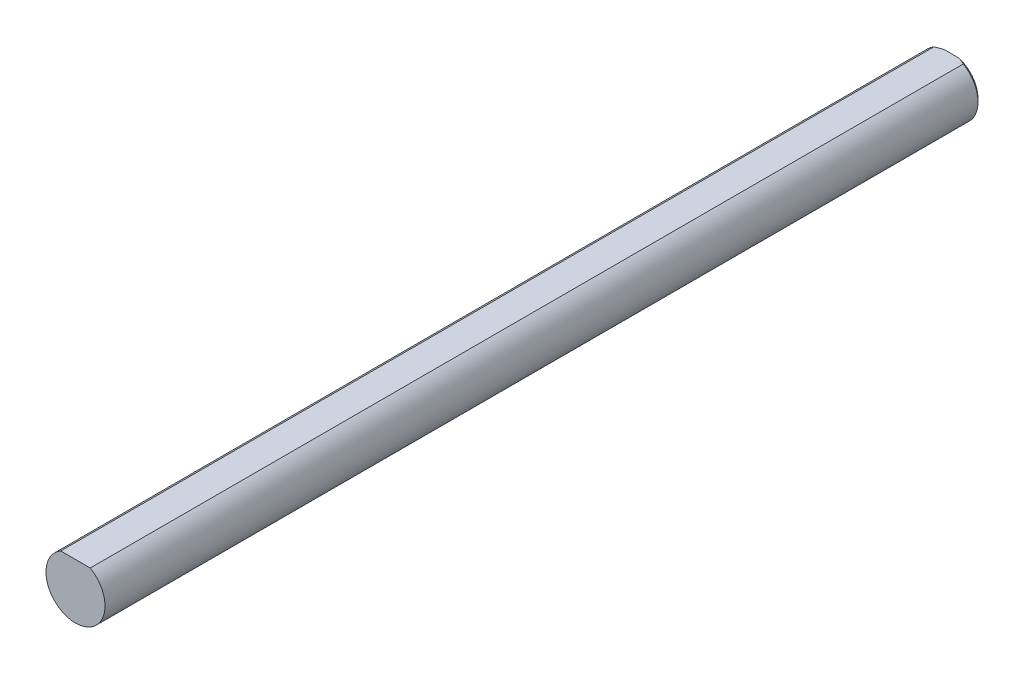
ISO-10303-21;
HEADER;
FILE_DESCRIPTION(('STEP AP214'),'2;1');
FILE_NAME('part.step','',(''),(''),'','','');
FILE_SCHEMA(('AUTOMOTIVE_DESIGN { 1 0 10303 214 1 1 1 1 }'));
ENDSEC;
DATA;
#1=APPLICATION_CONTEXT('core data for automotive mechanical design processes');
#2=APPLICATION_PROTOCOL_DEFINITION('international standard','automotive_design',2000,#1);
#3=PRODUCT_CONTEXT('',#1,'mechanical');
#4=PRODUCT('Part','Part','',(#3));
#5=PRODUCT_RELATED_PRODUCT_CATEGORY('part','',(#4));
#6=PRODUCT_DEFINITION_FORMATION('','',#4);
#7=PRODUCT_DEFINITION_CONTEXT('part definition',#1,'design');
#8=PRODUCT_DEFINITION('design','',#6,#7);
#9=PRODUCT_DEFINITION_SHAPE('','',#8);
#10=(LENGTH_UNIT() NAMED_UNIT(*) SI_UNIT(.MILLI.,.METRE.));
#11=(NAMED_UNIT(*) PLANE_ANGLE_UNIT() SI_UNIT($,.RADIAN.));
#12=(NAMED_UNIT(*) SI_UNIT($,.STERADIAN.) SOLID_ANGLE_UNIT());
#13=UNCERTAINTY_MEASURE_WITH_UNIT(LENGTH_MEASURE(1.E-05),#10,'distance_accuracy_value','');
#14=(GEOMETRIC_REPRESENTATION_CONTEXT(3) GLOBAL_UNCERTAINTY_ASSIGNED_CONTEXT((#13)) GLOBAL_UNIT_ASSIGNED_CONTEXT((#10,
#11,#12)) REPRESENTATION_CONTEXT('',''));
#15=CARTESIAN_POINT('',(0.,0.,0.));
#16=DIRECTION('',(0.,0.,1.));
#17=DIRECTION('',(1.,0.,0.));
#18=AXIS2_PLACEMENT_3D('',#15,#16,#17);
#19=CARTESIAN_POINT('',(0.,0.,76.2));
#20=DIRECTION('',(0.,0.,-1.));
#21=DIRECTION('',(-1.,0.,0.));
#22=AXIS2_PLACEMENT_3D('',#19,#20,#21);
#23=CYLINDRICAL_SURFACE('',#22,3.175);
#24=DIRECTION('',(0.,0.,1.));
#25=VECTOR('',#24,1.);
#26=CARTESIAN_POINT('',(1.5875,2.74963065701559,-76.2));
#27=LINE('',#26,#25);
#28=CARTESIAN_POINT('',(1.5875,2.74963065701559,-75.8824999999998));
#29=VERTEX_POINT('',#28);
#30=CARTESIAN_POINT('',(1.5875,2.74963065701559,18.));
#31=VERTEX_POINT('',#30);
#32=EDGE_CURVE('E80',#29,#31,#27,.T.);
#33=ORIENTED_EDGE('',*,*,#32,.T.);
#34=CARTESIAN_POINT('',(0.,0.,18.));
#35=DIRECTION('',(0.,0.,-1.));
#36=DIRECTION('',(-1.,0.,0.));
#37=AXIS2_PLACEMENT_3D('',#34,#35,#36);
#38=CIRCLE('',#37,3.175);
#39=CARTESIAN_POINT('',(-1.5875,2.74963065701559,18.));
#40=VERTEX_POINT('',#39);
#41=EDGE_CURVE('E54',#31,#40,#38,.T.);
#42=ORIENTED_EDGE('',*,*,#41,.T.);
#43=DIRECTION('',(0.,0.,1.));
#44=VECTOR('',#43,1.);
#45=CARTESIAN_POINT('',(-1.5875,2.74963065701559,-76.2));
#46=LINE('',#45,#44);
#47=CARTESIAN_POINT('',(-1.5875,2.74963065701559,-75.8824999999998));
#48=VERTEX_POINT('',#47);
#49=EDGE_CURVE('E78',#48,#40,#46,.T.);
#50=ORIENTED_EDGE('',*,*,#49,.F.);
#51=CARTESIAN_POINT('',(0.,0.,-75.8824999999998));
#52=DIRECTION('',(0.,0.,1.));
#53=DIRECTION('',(1.,0.,0.));
#54=AXIS2_PLACEMENT_3D('',#51,#52,#53);
#55=CIRCLE('',#54,3.175);
#56=EDGE_CURVE('E87',#48,#29,#55,.T.);
#57=ORIENTED_EDGE('',*,*,#56,.T.);
#58=EDGE_LOOP('',(#33,#42,#50,#57));
#59=FACE_BOUND('',#58,.T.);
#60=ADVANCED_FACE('F39',(#59),#23,.T.);
#61=CARTESIAN_POINT('',(0.,0.,-76.2));
#62=DIRECTION('',(0.,0.,1.));
#63=DIRECTION('',(1.,0.,0.));
#64=AXIS2_PLACEMENT_3D('',#61,#62,#63);
#65=PLANE('',#64);
#66=DIRECTION('',(1.,0.,0.));
#67=VECTOR('',#66,1.);
#68=CARTESIAN_POINT('',(-1.5875,2.74963065701559,-76.2));
#69=LINE('',#68,#67);
#70=CARTESIAN_POINT('',(-0.77771299333294,2.74963065701559,-76.2));
#71=VERTEX_POINT('',#70);
#72=CARTESIAN_POINT('',(0.77771299333294,2.74963065701559,-76.2));
#73=VERTEX_POINT('',#72);
#74=EDGE_CURVE('E81',#71,#73,#69,.T.);
#75=ORIENTED_EDGE('',*,*,#74,.T.);
#76=CARTESIAN_POINT('',(0.,0.,-76.2));
#77=DIRECTION('',(0.,0.,1.));
#78=DIRECTION('',(1.,0.,0.));
#79=AXIS2_PLACEMENT_3D('',#76,#77,#78);
#80=CIRCLE('',#79,2.8574999999998);
#81=EDGE_CURVE('E48',#73,#71,#80,.F.);
#82=ORIENTED_EDGE('',*,*,#81,.T.);
#83=EDGE_LOOP('',(#75,#82));
#84=FACE_BOUND('',#83,.T.);
#85=ADVANCED_FACE('F106',(#84),#65,.F.);
#86=CARTESIAN_POINT('',(-1.5875,2.74963065701559,-76.2));
#87=DIRECTION('',(0.,-1.,0.));
#88=DIRECTION('',(0.,0.,-1.));
#89=AXIS2_PLACEMENT_3D('',#86,#87,#88);
#90=PLANE('',#89);
#91=ORIENTED_EDGE('',*,*,#49,.T.);
#92=DIRECTION('',(1.,0.,0.));
#93=VECTOR('',#92,1.);
#94=CARTESIAN_POINT('',(-1.5875,2.74963065701559,18.));
#95=LINE('',#94,#93);
#96=EDGE_CURVE('E11',#40,#31,#95,.T.);
#97=ORIENTED_EDGE('',*,*,#96,.T.);
#98=ORIENTED_EDGE('',*,*,#32,.F.);
#99=CARTESIAN_POINT('',(1.5875,2.74963065701559,-75.8824999999998));
#100=CARTESIAN_POINT('',(1.52250516699264,2.74963065701559,-75.9149880824797));
#101=CARTESIAN_POINT('',(1.45690188238018,2.74963065701559,-75.9463019076192));
#102=CARTESIAN_POINT('',(1.32458227076999,2.74963065701559,-76.0060258514251));
#103=CARTESIAN_POINT('',(1.25786903887704,2.74963065701559,-76.0344428470168));
#104=CARTESIAN_POINT('',(1.12308918002457,2.74963065701559,-76.0879920057044));
#105=CARTESIAN_POINT('',(1.05502199036131,2.74963065701559,-76.1131227687341));
#106=CARTESIAN_POINT('',(0.917422256787398,2.74963065701559,-76.1595821959476));
#107=CARTESIAN_POINT('',(0.84788654327487,2.74963065701559,-76.1809014355307));
#108=CARTESIAN_POINT('',(0.777712993332939,2.74963065701559,-76.2));
#109=B_SPLINE_CURVE_WITH_KNOTS('',3,(#99,#100,#101,#102,#103,#104,#105,#106,#107,#108),
.UNSPECIFIED.,.F.,.F.,(4,2,2,2,4),(0.,0.218002568777967,0.435474929897523,0.653039643131099,
0.871135095681305),.UNSPECIFIED.);
#110=EDGE_CURVE('E61',#29,#73,#109,.T.);
#111=ORIENTED_EDGE('',*,*,#110,.T.);
#112=ORIENTED_EDGE('',*,*,#74,.F.);
#113=CARTESIAN_POINT('',(-0.77771299333294,2.74963065701559,-76.2));
#114=CARTESIAN_POINT('',(-0.847886543274871,2.74963065701559,-76.1809014355307));
#115=CARTESIAN_POINT('',(-0.917422256787399,2.74963065701559,-76.1595821959476));
#116=CARTESIAN_POINT('',(-1.05502199036131,2.74963065701559,-76.1131227687341));
#117=CARTESIAN_POINT('',(-1.12308918002457,2.74963065701559,-76.0879920057044));
#118=CARTESIAN_POINT('',(-1.25786903887704,2.74963065701559,-76.0344428470168));
#119=CARTESIAN_POINT('',(-1.32458227076999,2.74963065701559,-76.0060258514251));
#120=CARTESIAN_POINT('',(-1.45690188238018,2.74963065701559,-75.9463019076192));
#121=CARTESIAN_POINT('',(-1.52250516699264,2.74963065701559,-75.9149880824797));
#122=CARTESIAN_POINT('',(-1.5875,2.74963065701559,-75.8824999999998));
#123=B_SPLINE_CURVE_WITH_KNOTS('',3,(#113,#114,#115,#116,#117,#118,#119,#120,#121,#122),
.UNSPECIFIED.,.F.,.F.,(4,2,2,2,4),(0.,0.218095452550206,0.435660165783782,0.653132526903341,
0.871135095681305),.UNSPECIFIED.);
#124=EDGE_CURVE('E85',#71,#48,#123,.T.);
#125=ORIENTED_EDGE('',*,*,#124,.T.);
#126=EDGE_LOOP('',(#91,#97,#98,#111,#112,#125));
#127=FACE_BOUND('',#126,.T.);
#128=ADVANCED_FACE('F83',(#127),#90,.F.);
#129=CARTESIAN_POINT('',(0.,0.,-75.8824999999998));
#130=DIRECTION('',(0.,0.,1.));
#131=DIRECTION('',(1.,0.,0.));
#132=AXIS2_PLACEMENT_3D('',#129,#130,#131);
#133=CONICAL_SURFACE('',#132,3.175,0.785398163397453);
#134=ORIENTED_EDGE('',*,*,#124,.F.);
#135=ORIENTED_EDGE('',*,*,#81,.F.);
#136=ORIENTED_EDGE('',*,*,#110,.F.);
#137=ORIENTED_EDGE('',*,*,#56,.F.);
#138=EDGE_LOOP('',(#134,#135,#136,#137));
#139=FACE_BOUND('',#138,.T.);
#140=ADVANCED_FACE('F41',(#139),#133,.T.);
#141=CARTESIAN_POINT('',(0.,0.,18.));
#142=DIRECTION('',(0.,0.,-1.));
#143=DIRECTION('',(-1.,0.,0.));
#144=AXIS2_PLACEMENT_3D('',#141,#142,#143);
#145=PLANE('',#144);
#146=ORIENTED_EDGE('',*,*,#96,.F.);
#147=ORIENTED_EDGE('',*,*,#41,.F.);
#148=EDGE_LOOP('',(#146,#147));
#149=FACE_BOUND('',#148,.T.);
#150=ADVANCED_FACE('F72',(#149),#145,.F.);
#151=CLOSED_SHELL('',(#60,#85,#128,#140,#150));
#152=MANIFOLD_SOLID_BREP('B2',#151);
#153=ADVANCED_BREP_SHAPE_REPRESENTATION('',(#18,#152),#14);
#154=SHAPE_DEFINITION_REPRESENTATION(#9,#153);
ENDSEC;
END-ISO-10303-21;
